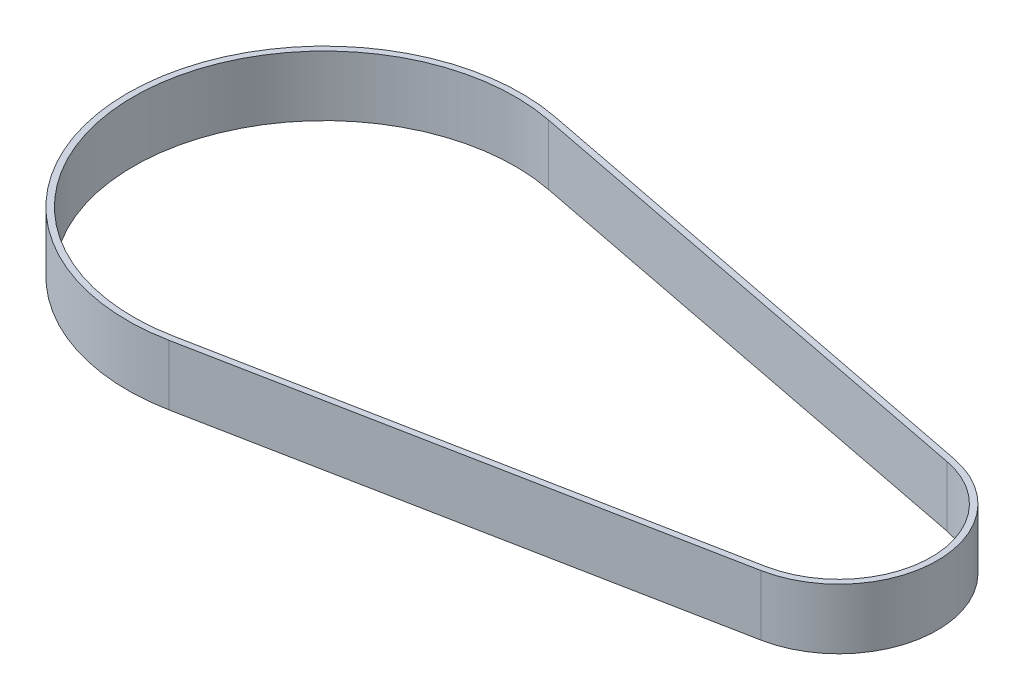
ISO-10303-21;
HEADER;
FILE_DESCRIPTION(('STEP AP214'),'2;1');
FILE_NAME('part.step','',(''),(''),'','','');
FILE_SCHEMA(('AUTOMOTIVE_DESIGN { 1 0 10303 214 1 1 1 1 }'));
ENDSEC;
DATA;
#1=APPLICATION_CONTEXT('core data for automotive mechanical design processes');
#2=APPLICATION_PROTOCOL_DEFINITION('international standard','automotive_design',2000,#1);
#3=PRODUCT_CONTEXT('',#1,'mechanical');
#4=PRODUCT('Part','Part','',(#3));
#5=PRODUCT_RELATED_PRODUCT_CATEGORY('part','',(#4));
#6=PRODUCT_DEFINITION_FORMATION('','',#4);
#7=PRODUCT_DEFINITION_CONTEXT('part definition',#1,'design');
#8=PRODUCT_DEFINITION('design','',#6,#7);
#9=PRODUCT_DEFINITION_SHAPE('','',#8);
#10=(LENGTH_UNIT() NAMED_UNIT(*) SI_UNIT(.MILLI.,.METRE.));
#11=(NAMED_UNIT(*) PLANE_ANGLE_UNIT() SI_UNIT($,.RADIAN.));
#12=(NAMED_UNIT(*) SI_UNIT($,.STERADIAN.) SOLID_ANGLE_UNIT());
#13=UNCERTAINTY_MEASURE_WITH_UNIT(LENGTH_MEASURE(1.E-05),#10,'distance_accuracy_value','');
#14=(GEOMETRIC_REPRESENTATION_CONTEXT(3) GLOBAL_UNCERTAINTY_ASSIGNED_CONTEXT((#13)) GLOBAL_UNIT_ASSIGNED_CONTEXT((#10,
#11,#12)) REPRESENTATION_CONTEXT('',''));
#15=CARTESIAN_POINT('',(0.,0.,0.));
#16=DIRECTION('',(0.,0.,1.));
#17=DIRECTION('',(1.,0.,0.));
#18=AXIS2_PLACEMENT_3D('',#15,#16,#17);
#19=CARTESIAN_POINT('',(0.,15.,0.));
#20=DIRECTION('',(0.,1.,0.));
#21=DIRECTION('',(0.,0.,1.));
#22=AXIS2_PLACEMENT_3D('',#19,#20,#21);
#23=PLANE('',#22);
#24=CARTESIAN_POINT('',(0.,15.,0.));
#25=DIRECTION('',(0.,1.,0.));
#26=DIRECTION('',(0.,0.,1.));
#27=AXIS2_PLACEMENT_3D('',#24,#25,#26);
#28=CIRCLE('',#27,49.);
#29=CARTESIAN_POINT('',(9.37890625,15.,-48.0940341160285));
#30=VERTEX_POINT('',#29);
#31=CARTESIAN_POINT('',(9.37890624999999,15.,48.0940341160285));
#32=VERTEX_POINT('',#31);
#33=EDGE_CURVE('E134',#30,#32,#28,.T.);
#34=ORIENTED_EDGE('',*,*,#33,.T.);
#35=DIRECTION('',(0.981510900327112,0.,-0.19140625));
#36=VECTOR('',#35,1.);
#37=CARTESIAN_POINT('',(9.37890624999999,15.,48.0940341160285));
#38=LINE('',#37,#36);
#39=CARTESIAN_POINT('',(132.689453125,15.,24.0470170580143));
#40=VERTEX_POINT('',#39);
#41=EDGE_CURVE('E137',#32,#40,#38,.T.);
#42=ORIENTED_EDGE('',*,*,#41,.T.);
#43=CARTESIAN_POINT('',(128.,15.,0.));
#44=DIRECTION('',(0.,1.,0.));
#45=DIRECTION('',(0.,0.,-1.));
#46=AXIS2_PLACEMENT_3D('',#43,#44,#45);
#47=CIRCLE('',#46,24.5);
#48=CARTESIAN_POINT('',(132.689453125,15.,-24.0470170580143));
#49=VERTEX_POINT('',#48);
#50=EDGE_CURVE('E140',#40,#49,#47,.T.);
#51=ORIENTED_EDGE('',*,*,#50,.T.);
#52=DIRECTION('',(-0.981510900327112,0.,-0.19140625));
#53=VECTOR('',#52,1.);
#54=CARTESIAN_POINT('',(9.37890625,15.,-48.0940341160285));
#55=LINE('',#54,#53);
#56=EDGE_CURVE('E142',#49,#30,#55,.T.);
#57=ORIENTED_EDGE('',*,*,#56,.T.);
#58=EDGE_LOOP('',(#34,#42,#51,#57));
#59=FACE_BOUND('',#58,.T.);
#60=DIRECTION('',(0.981510900327112,0.,-0.19140625));
#61=VECTOR('',#60,1.);
#62=CARTESIAN_POINT('',(9.091796875,15.,46.6217677655378));
#63=LINE('',#62,#61);
#64=CARTESIAN_POINT('',(9.091796875,15.,46.6217677655378));
#65=VERTEX_POINT('',#64);
#66=CARTESIAN_POINT('',(132.40234375,15.,22.5747507075236));
#67=VERTEX_POINT('',#66);
#68=EDGE_CURVE('E106',#65,#67,#63,.T.);
#69=ORIENTED_EDGE('',*,*,#68,.F.);
#70=CARTESIAN_POINT('',(0.,15.,0.));
#71=DIRECTION('',(0.,1.,0.));
#72=DIRECTION('',(0.,0.,1.));
#73=AXIS2_PLACEMENT_3D('',#70,#71,#72);
#74=CIRCLE('',#73,47.5);
#75=CARTESIAN_POINT('',(9.091796875,15.,-46.6217677655378));
#76=VERTEX_POINT('',#75);
#77=EDGE_CURVE('E98',#76,#65,#74,.T.);
#78=ORIENTED_EDGE('',*,*,#77,.F.);
#79=DIRECTION('',(-0.981510900327112,0.,-0.19140625));
#80=VECTOR('',#79,1.);
#81=CARTESIAN_POINT('',(9.091796875,15.,-46.6217677655378));
#82=LINE('',#81,#80);
#83=CARTESIAN_POINT('',(132.40234375,15.,-22.5747507075236));
#84=VERTEX_POINT('',#83);
#85=EDGE_CURVE('E120',#84,#76,#82,.T.);
#86=ORIENTED_EDGE('',*,*,#85,.F.);
#87=CARTESIAN_POINT('',(128.,15.,0.));
#88=DIRECTION('',(0.,1.,0.));
#89=DIRECTION('',(0.,0.,-1.));
#90=AXIS2_PLACEMENT_3D('',#87,#88,#89);
#91=CIRCLE('',#90,23.);
#92=EDGE_CURVE('E118',#67,#84,#91,.T.);
#93=ORIENTED_EDGE('',*,*,#92,.F.);
#94=EDGE_LOOP('',(#69,#78,#86,#93));
#95=FACE_BOUND('',#94,.T.);
#96=ADVANCED_FACE('F33',(#59,#95),#23,.T.);
#97=CARTESIAN_POINT('',(0.,0.,0.));
#98=DIRECTION('',(0.,1.,0.));
#99=DIRECTION('',(0.,0.,1.));
#100=AXIS2_PLACEMENT_3D('',#97,#98,#99);
#101=PLANE('',#100);
#102=CARTESIAN_POINT('',(0.,0.,0.));
#103=DIRECTION('',(0.,1.,0.));
#104=DIRECTION('',(0.,0.,1.));
#105=AXIS2_PLACEMENT_3D('',#102,#103,#104);
#106=CIRCLE('',#105,49.);
#107=CARTESIAN_POINT('',(9.37890625,0.,-48.0940341160285));
#108=VERTEX_POINT('',#107);
#109=CARTESIAN_POINT('',(9.37890624999999,0.,48.0940341160285));
#110=VERTEX_POINT('',#109);
#111=EDGE_CURVE('E114',#108,#110,#106,.T.);
#112=ORIENTED_EDGE('',*,*,#111,.F.);
#113=DIRECTION('',(-0.981510900327112,0.,-0.19140625));
#114=VECTOR('',#113,1.);
#115=CARTESIAN_POINT('',(9.37890625,0.,-48.0940341160285));
#116=LINE('',#115,#114);
#117=CARTESIAN_POINT('',(132.689453125,0.,-24.0470170580143));
#118=VERTEX_POINT('',#117);
#119=EDGE_CURVE('E138',#118,#108,#116,.T.);
#120=ORIENTED_EDGE('',*,*,#119,.F.);
#121=CARTESIAN_POINT('',(128.,0.,0.));
#122=DIRECTION('',(0.,1.,0.));
#123=DIRECTION('',(0.,0.,-1.));
#124=AXIS2_PLACEMENT_3D('',#121,#122,#123);
#125=CIRCLE('',#124,24.5);
#126=CARTESIAN_POINT('',(132.689453125,0.,24.0470170580143));
#127=VERTEX_POINT('',#126);
#128=EDGE_CURVE('E149',#127,#118,#125,.T.);
#129=ORIENTED_EDGE('',*,*,#128,.F.);
#130=DIRECTION('',(0.981510900327112,0.,-0.19140625));
#131=VECTOR('',#130,1.);
#132=CARTESIAN_POINT('',(9.37890624999999,0.,48.0940341160285));
#133=LINE('',#132,#131);
#134=EDGE_CURVE('E147',#110,#127,#133,.T.);
#135=ORIENTED_EDGE('',*,*,#134,.F.);
#136=EDGE_LOOP('',(#112,#120,#129,#135));
#137=FACE_BOUND('',#136,.T.);
#138=CARTESIAN_POINT('',(0.,0.,0.));
#139=DIRECTION('',(0.,1.,0.));
#140=DIRECTION('',(0.,0.,1.));
#141=AXIS2_PLACEMENT_3D('',#138,#139,#140);
#142=CIRCLE('',#141,47.5);
#143=CARTESIAN_POINT('',(9.091796875,0.,-46.6217677655378));
#144=VERTEX_POINT('',#143);
#145=CARTESIAN_POINT('',(9.091796875,0.,46.6217677655378));
#146=VERTEX_POINT('',#145);
#147=EDGE_CURVE('E56',#144,#146,#142,.T.);
#148=ORIENTED_EDGE('',*,*,#147,.T.);
#149=DIRECTION('',(0.981510900327112,0.,-0.19140625));
#150=VECTOR('',#149,1.);
#151=CARTESIAN_POINT('',(9.091796875,0.,46.6217677655378));
#152=LINE('',#151,#150);
#153=CARTESIAN_POINT('',(132.40234375,0.,22.5747507075236));
#154=VERTEX_POINT('',#153);
#155=EDGE_CURVE('E113',#146,#154,#152,.T.);
#156=ORIENTED_EDGE('',*,*,#155,.T.);
#157=CARTESIAN_POINT('',(128.,0.,0.));
#158=DIRECTION('',(0.,1.,0.));
#159=DIRECTION('',(0.,0.,-1.));
#160=AXIS2_PLACEMENT_3D('',#157,#158,#159);
#161=CIRCLE('',#160,23.);
#162=CARTESIAN_POINT('',(132.40234375,0.,-22.5747507075236));
#163=VERTEX_POINT('',#162);
#164=EDGE_CURVE('E126',#154,#163,#161,.T.);
#165=ORIENTED_EDGE('',*,*,#164,.T.);
#166=DIRECTION('',(-0.981510900327112,0.,-0.19140625));
#167=VECTOR('',#166,1.);
#168=CARTESIAN_POINT('',(9.091796875,0.,-46.6217677655378));
#169=LINE('',#168,#167);
#170=EDGE_CURVE('E107',#163,#144,#169,.T.);
#171=ORIENTED_EDGE('',*,*,#170,.T.);
#172=EDGE_LOOP('',(#148,#156,#165,#171));
#173=FACE_BOUND('',#172,.T.);
#174=ADVANCED_FACE('F167',(#137,#173),#101,.F.);
#175=CARTESIAN_POINT('',(0.,15.,0.));
#176=DIRECTION('',(0.,-1.,0.));
#177=DIRECTION('',(0.,0.,-1.));
#178=AXIS2_PLACEMENT_3D('',#175,#176,#177);
#179=CYLINDRICAL_SURFACE('',#178,49.);
#180=ORIENTED_EDGE('',*,*,#111,.T.);
#181=DIRECTION('',(0.,-1.,0.));
#182=VECTOR('',#181,1.);
#183=CARTESIAN_POINT('',(9.37890624999999,15.,48.0940341160285));
#184=LINE('',#183,#182);
#185=EDGE_CURVE('E11',#32,#110,#184,.T.);
#186=ORIENTED_EDGE('',*,*,#185,.F.);
#187=ORIENTED_EDGE('',*,*,#33,.F.);
#188=DIRECTION('',(0.,-1.,0.));
#189=VECTOR('',#188,1.);
#190=CARTESIAN_POINT('',(9.37890625,15.,-48.0940341160285));
#191=LINE('',#190,#189);
#192=EDGE_CURVE('E144',#30,#108,#191,.T.);
#193=ORIENTED_EDGE('',*,*,#192,.T.);
#194=EDGE_LOOP('',(#180,#186,#187,#193));
#195=FACE_BOUND('',#194,.T.);
#196=ADVANCED_FACE('F35',(#195),#179,.T.);
#197=CARTESIAN_POINT('',(9.37890624999999,15.,48.0940341160285));
#198=DIRECTION('',(-0.19140625,0.,-0.981510900327112));
#199=DIRECTION('',(-0.981510900327112,0.,0.19140625));
#200=AXIS2_PLACEMENT_3D('',#197,#198,#199);
#201=PLANE('',#200);
#202=ORIENTED_EDGE('',*,*,#134,.T.);
#203=DIRECTION('',(0.,-1.,0.));
#204=VECTOR('',#203,1.);
#205=CARTESIAN_POINT('',(132.689453125,15.,24.0470170580143));
#206=LINE('',#205,#204);
#207=EDGE_CURVE('E41',#40,#127,#206,.T.);
#208=ORIENTED_EDGE('',*,*,#207,.F.);
#209=ORIENTED_EDGE('',*,*,#41,.F.);
#210=ORIENTED_EDGE('',*,*,#185,.T.);
#211=EDGE_LOOP('',(#202,#208,#209,#210));
#212=FACE_BOUND('',#211,.T.);
#213=ADVANCED_FACE('F177',(#212),#201,.F.);
#214=CARTESIAN_POINT('',(128.,15.,0.));
#215=DIRECTION('',(0.,-1.,0.));
#216=DIRECTION('',(0.,0.,-1.));
#217=AXIS2_PLACEMENT_3D('',#214,#215,#216);
#218=CYLINDRICAL_SURFACE('',#217,24.5);
#219=ORIENTED_EDGE('',*,*,#128,.T.);
#220=DIRECTION('',(0.,-1.,0.));
#221=VECTOR('',#220,1.);
#222=CARTESIAN_POINT('',(132.689453125,15.,-24.0470170580143));
#223=LINE('',#222,#221);
#224=EDGE_CURVE('E154',#49,#118,#223,.T.);
#225=ORIENTED_EDGE('',*,*,#224,.F.);
#226=ORIENTED_EDGE('',*,*,#50,.F.);
#227=ORIENTED_EDGE('',*,*,#207,.T.);
#228=EDGE_LOOP('',(#219,#225,#226,#227));
#229=FACE_BOUND('',#228,.T.);
#230=ADVANCED_FACE('F161',(#229),#218,.T.);
#231=CARTESIAN_POINT('',(9.37890625,15.,-48.0940341160285));
#232=DIRECTION('',(-0.19140625,0.,0.981510900327112));
#233=DIRECTION('',(0.981510900327112,0.,0.19140625));
#234=AXIS2_PLACEMENT_3D('',#231,#232,#233);
#235=PLANE('',#234);
#236=ORIENTED_EDGE('',*,*,#119,.T.);
#237=ORIENTED_EDGE('',*,*,#192,.F.);
#238=ORIENTED_EDGE('',*,*,#56,.F.);
#239=ORIENTED_EDGE('',*,*,#224,.T.);
#240=EDGE_LOOP('',(#236,#237,#238,#239));
#241=FACE_BOUND('',#240,.T.);
#242=ADVANCED_FACE('F171',(#241),#235,.F.);
#243=CARTESIAN_POINT('',(0.,15.,0.));
#244=DIRECTION('',(0.,-1.,0.));
#245=DIRECTION('',(0.,0.,-1.));
#246=AXIS2_PLACEMENT_3D('',#243,#244,#245);
#247=CYLINDRICAL_SURFACE('',#246,47.5);
#248=ORIENTED_EDGE('',*,*,#147,.F.);
#249=DIRECTION('',(0.,-1.,0.));
#250=VECTOR('',#249,1.);
#251=CARTESIAN_POINT('',(9.091796875,15.,-46.6217677655378));
#252=LINE('',#251,#250);
#253=EDGE_CURVE('E102',#76,#144,#252,.T.);
#254=ORIENTED_EDGE('',*,*,#253,.F.);
#255=ORIENTED_EDGE('',*,*,#77,.T.);
#256=DIRECTION('',(0.,-1.,0.));
#257=VECTOR('',#256,1.);
#258=CARTESIAN_POINT('',(9.091796875,15.,46.6217677655378));
#259=LINE('',#258,#257);
#260=EDGE_CURVE('E101',#65,#146,#259,.T.);
#261=ORIENTED_EDGE('',*,*,#260,.T.);
#262=EDGE_LOOP('',(#248,#254,#255,#261));
#263=FACE_BOUND('',#262,.T.);
#264=ADVANCED_FACE('F100',(#263),#247,.F.);
#265=CARTESIAN_POINT('',(9.091796875,15.,46.6217677655378));
#266=DIRECTION('',(-0.19140625,0.,-0.981510900327112));
#267=DIRECTION('',(-0.981510900327112,0.,0.19140625));
#268=AXIS2_PLACEMENT_3D('',#265,#266,#267);
#269=PLANE('',#268);
#270=ORIENTED_EDGE('',*,*,#155,.F.);
#271=ORIENTED_EDGE('',*,*,#260,.F.);
#272=ORIENTED_EDGE('',*,*,#68,.T.);
#273=DIRECTION('',(0.,-1.,0.));
#274=VECTOR('',#273,1.);
#275=CARTESIAN_POINT('',(132.40234375,15.,22.5747507075236));
#276=LINE('',#275,#274);
#277=EDGE_CURVE('E115',#67,#154,#276,.T.);
#278=ORIENTED_EDGE('',*,*,#277,.T.);
#279=EDGE_LOOP('',(#270,#271,#272,#278));
#280=FACE_BOUND('',#279,.T.);
#281=ADVANCED_FACE('F110',(#280),#269,.T.);
#282=CARTESIAN_POINT('',(128.,15.,0.));
#283=DIRECTION('',(0.,-1.,0.));
#284=DIRECTION('',(0.,0.,-1.));
#285=AXIS2_PLACEMENT_3D('',#282,#283,#284);
#286=CYLINDRICAL_SURFACE('',#285,23.);
#287=ORIENTED_EDGE('',*,*,#164,.F.);
#288=ORIENTED_EDGE('',*,*,#277,.F.);
#289=ORIENTED_EDGE('',*,*,#92,.T.);
#290=DIRECTION('',(0.,-1.,0.));
#291=VECTOR('',#290,1.);
#292=CARTESIAN_POINT('',(132.40234375,15.,-22.5747507075236));
#293=LINE('',#292,#291);
#294=EDGE_CURVE('E48',#84,#163,#293,.T.);
#295=ORIENTED_EDGE('',*,*,#294,.T.);
#296=EDGE_LOOP('',(#287,#288,#289,#295));
#297=FACE_BOUND('',#296,.T.);
#298=ADVANCED_FACE('F200',(#297),#286,.F.);
#299=CARTESIAN_POINT('',(9.091796875,15.,-46.6217677655378));
#300=DIRECTION('',(-0.19140625,0.,0.981510900327112));
#301=DIRECTION('',(0.981510900327112,0.,0.19140625));
#302=AXIS2_PLACEMENT_3D('',#299,#300,#301);
#303=PLANE('',#302);
#304=ORIENTED_EDGE('',*,*,#170,.F.);
#305=ORIENTED_EDGE('',*,*,#294,.F.);
#306=ORIENTED_EDGE('',*,*,#85,.T.);
#307=ORIENTED_EDGE('',*,*,#253,.T.);
#308=EDGE_LOOP('',(#304,#305,#306,#307));
#309=FACE_BOUND('',#308,.T.);
#310=ADVANCED_FACE('F204',(#309),#303,.T.);
#311=CLOSED_SHELL('',(#96,#174,#196,#213,#230,#242,#264,#281,#298,#310));
#312=MANIFOLD_SOLID_BREP('B2',#311);
#313=ADVANCED_BREP_SHAPE_REPRESENTATION('',(#18,#312),#14);
#314=SHAPE_DEFINITION_REPRESENTATION(#9,#313);
ENDSEC;
END-ISO-10303-21;
